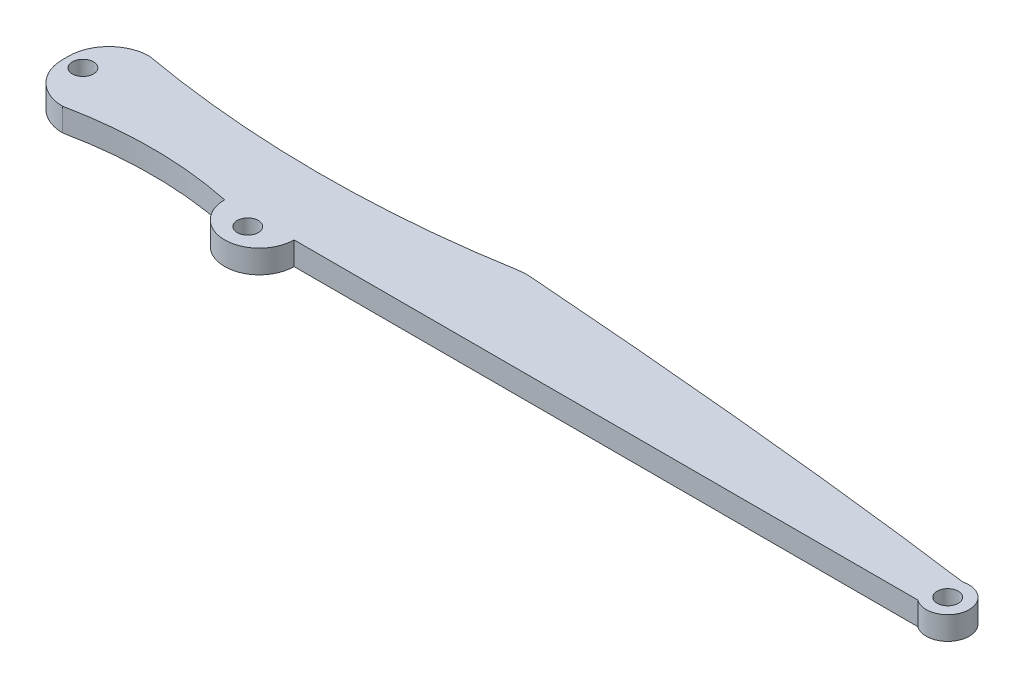
ISO-10303-21;
HEADER;
FILE_DESCRIPTION(('STEP AP214'),'2;1');
FILE_NAME('part.step','',(''),(''),'','','');
FILE_SCHEMA(('AUTOMOTIVE_DESIGN { 1 0 10303 214 1 1 1 1 }'));
ENDSEC;
DATA;
#1=APPLICATION_CONTEXT('core data for automotive mechanical design processes');
#2=APPLICATION_PROTOCOL_DEFINITION('international standard','automotive_design',2000,#1);
#3=PRODUCT_CONTEXT('',#1,'mechanical');
#4=PRODUCT('Part','Part','',(#3));
#5=PRODUCT_RELATED_PRODUCT_CATEGORY('part','',(#4));
#6=PRODUCT_DEFINITION_FORMATION('','',#4);
#7=PRODUCT_DEFINITION_CONTEXT('part definition',#1,'design');
#8=PRODUCT_DEFINITION('design','',#6,#7);
#9=PRODUCT_DEFINITION_SHAPE('','',#8);
#10=(LENGTH_UNIT() NAMED_UNIT(*) SI_UNIT(.MILLI.,.METRE.));
#11=(NAMED_UNIT(*) PLANE_ANGLE_UNIT() SI_UNIT($,.RADIAN.));
#12=(NAMED_UNIT(*) SI_UNIT($,.STERADIAN.) SOLID_ANGLE_UNIT());
#13=UNCERTAINTY_MEASURE_WITH_UNIT(LENGTH_MEASURE(1.E-05),#10,'distance_accuracy_value','');
#14=(GEOMETRIC_REPRESENTATION_CONTEXT(3) GLOBAL_UNCERTAINTY_ASSIGNED_CONTEXT((#13)) GLOBAL_UNIT_ASSIGNED_CONTEXT((#10,
#11,#12)) REPRESENTATION_CONTEXT('',''));
#15=CARTESIAN_POINT('',(0.,0.,0.));
#16=DIRECTION('',(0.,0.,1.));
#17=DIRECTION('',(1.,0.,0.));
#18=AXIS2_PLACEMENT_3D('',#15,#16,#17);
#19=CARTESIAN_POINT('',(-80.,4.,7.5));
#20=DIRECTION('',(0.,0.,-1.));
#21=DIRECTION('',(-1.,0.,0.));
#22=AXIS2_PLACEMENT_3D('',#19,#20,#21);
#23=PLANE('',#22);
#24=DIRECTION('',(1.,0.,0.));
#25=VECTOR('',#24,1.);
#26=CARTESIAN_POINT('',(-80.,0.,7.5));
#27=LINE('',#26,#25);
#28=CARTESIAN_POINT('',(-33.,0.,7.5));
#29=VERTEX_POINT('',#28);
#30=CARTESIAN_POINT('',(74.8247790125888,0.,7.5));
#31=VERTEX_POINT('',#30);
#32=EDGE_CURVE('E125',#29,#31,#27,.T.);
#33=ORIENTED_EDGE('',*,*,#32,.T.);
#34=DIRECTION('',(0.,1.,0.));
#35=VECTOR('',#34,1.);
#36=CARTESIAN_POINT('',(74.8247790125888,-10.4810634361497,7.5));
#37=LINE('',#36,#35);
#38=CARTESIAN_POINT('',(74.8247790125888,4.,7.5));
#39=VERTEX_POINT('',#38);
#40=EDGE_CURVE('E109',#31,#39,#37,.T.);
#41=ORIENTED_EDGE('',*,*,#40,.T.);
#42=DIRECTION('',(1.,0.,0.));
#43=VECTOR('',#42,1.);
#44=CARTESIAN_POINT('',(-80.,4.,7.5));
#45=LINE('',#44,#43);
#46=CARTESIAN_POINT('',(-33.,4.,7.5));
#47=VERTEX_POINT('',#46);
#48=EDGE_CURVE('E137',#47,#39,#45,.T.);
#49=ORIENTED_EDGE('',*,*,#48,.F.);
#50=DIRECTION('',(0.,-1.,0.));
#51=VECTOR('',#50,1.);
#52=CARTESIAN_POINT('',(-33.,17.4164078649987,7.5));
#53=LINE('',#52,#51);
#54=EDGE_CURVE('E131',#47,#29,#53,.T.);
#55=ORIENTED_EDGE('',*,*,#54,.T.);
#56=EDGE_LOOP('',(#33,#41,#49,#55));
#57=FACE_BOUND('',#56,.T.);
#58=ADVANCED_FACE('F33',(#57),#23,.F.);
#59=CARTESIAN_POINT('',(-80.,4.,-7.5));
#60=DIRECTION('',(1.,0.,0.));
#61=DIRECTION('',(0.,0.,-1.));
#62=AXIS2_PLACEMENT_3D('',#59,#60,#61);
#63=PLANE('',#62);
#64=DIRECTION('',(0.,0.,1.));
#65=VECTOR('',#64,1.);
#66=CARTESIAN_POINT('',(-80.,4.,-7.5));
#67=LINE('',#66,#65);
#68=CARTESIAN_POINT('',(-80.,4.,-0.5));
#69=VERTEX_POINT('',#68);
#70=CARTESIAN_POINT('',(-80.,4.,0.5));
#71=VERTEX_POINT('',#70);
#72=EDGE_CURVE('E133',#69,#71,#67,.T.);
#73=ORIENTED_EDGE('',*,*,#72,.F.);
#74=DIRECTION('',(0.,-1.,0.));
#75=VECTOR('',#74,1.);
#76=CARTESIAN_POINT('',(-80.,4.,-0.5));
#77=LINE('',#76,#75);
#78=CARTESIAN_POINT('',(-80.,0.,-0.5));
#79=VERTEX_POINT('',#78);
#80=EDGE_CURVE('E146',#69,#79,#77,.T.);
#81=ORIENTED_EDGE('',*,*,#80,.T.);
#82=DIRECTION('',(0.,0.,1.));
#83=VECTOR('',#82,1.);
#84=CARTESIAN_POINT('',(-80.,0.,-7.5));
#85=LINE('',#84,#83);
#86=CARTESIAN_POINT('',(-80.,0.,0.5));
#87=VERTEX_POINT('',#86);
#88=EDGE_CURVE('E134',#79,#87,#85,.T.);
#89=ORIENTED_EDGE('',*,*,#88,.T.);
#90=DIRECTION('',(0.,-1.,0.));
#91=VECTOR('',#90,1.);
#92=CARTESIAN_POINT('',(-80.,4.,0.5));
#93=LINE('',#92,#91);
#94=EDGE_CURVE('E144',#87,#71,#93,.F.);
#95=ORIENTED_EDGE('',*,*,#94,.T.);
#96=EDGE_LOOP('',(#73,#81,#89,#95));
#97=FACE_BOUND('',#96,.T.);
#98=ADVANCED_FACE('F225',(#97),#63,.F.);
#99=CARTESIAN_POINT('',(0.,4.,0.));
#100=DIRECTION('',(0.,1.,0.));
#101=DIRECTION('',(0.,0.,1.));
#102=AXIS2_PLACEMENT_3D('',#99,#100,#101);
#103=PLANE('',#102);
#104=CARTESIAN_POINT('',(77.,4.,4.5));
#105=DIRECTION('',(0.,1.,0.));
#106=DIRECTION('',(0.,0.,1.));
#107=AXIS2_PLACEMENT_3D('',#104,#105,#106);
#108=CIRCLE('',#107,1.82499999999999);
#109=CARTESIAN_POINT('',(77.,4.,6.32499999999999));
#110=VERTEX_POINT('',#109);
#111=EDGE_CURVE('E282',#110,#110,#108,.T.);
#112=ORIENTED_EDGE('',*,*,#111,.F.);
#113=EDGE_LOOP('',(#112));
#114=FACE_BOUND('',#113,.T.);
#115=CARTESIAN_POINT('',(-8.23154683285153,4.,-7.5));
#116=CARTESIAN_POINT('',(14.2900819028801,4.,-5.87033542457917));
#117=CARTESIAN_POINT('',(49.538058277819,4.,-2.84864090917084));
#118=CARTESIAN_POINT('',(69.5080011227634,4.,0.0694157231703041));
#119=CARTESIAN_POINT('',(80.,4.,1.44942523242543));
#120=B_SPLINE_CURVE_WITH_KNOTS('',4,(#115,#116,#117,#118,#119),.UNSPECIFIED.,.F.,.F.,(5,5),(0.,
1.),.UNSPECIFIED.);
#121=CARTESIAN_POINT('',(-6.91713882315305,4.,-7.40429554869277));
#122=VERTEX_POINT('',#121);
#123=CARTESIAN_POINT('',(76.0393114114951,4.,0.921080640753333));
#124=VERTEX_POINT('',#123);
#125=EDGE_CURVE('E171',#122,#124,#120,.T.);
#126=ORIENTED_EDGE('',*,*,#125,.F.);
#127=CARTESIAN_POINT('',(-7.64776066769948,4.,2.56897832302416));
#128=DIRECTION('',(0.,1.,0.));
#129=DIRECTION('',(0.,0.,1.));
#130=AXIS2_PLACEMENT_3D('',#127,#128,#129);
#131=CIRCLE('',#130,10.);
#132=CARTESIAN_POINT('',(-9.33922759363612,4.,-7.28693054620055));
#133=VERTEX_POINT('',#132);
#134=EDGE_CURVE('E55',#122,#133,#131,.T.);
#135=ORIENTED_EDGE('',*,*,#134,.T.);
#136=CARTESIAN_POINT('',(-40.5610772171569,4.,-189.211684675024));
#137=DIRECTION('',(0.,1.,0.));
#138=DIRECTION('',(0.,0.,1.));
#139=AXIS2_PLACEMENT_3D('',#136,#137,#138);
#140=CIRCLE('',#139,184.584452375455);
#141=CARTESIAN_POINT('',(-73.,4.,-7.5));
#142=VERTEX_POINT('',#141);
#143=EDGE_CURVE('E120',#142,#133,#140,.T.);
#144=ORIENTED_EDGE('',*,*,#143,.F.);
#145=CARTESIAN_POINT('',(-73.,4.,-0.5));
#146=DIRECTION('',(0.,1.,0.));
#147=DIRECTION('',(0.,0.,1.));
#148=AXIS2_PLACEMENT_3D('',#145,#146,#147);
#149=CIRCLE('',#148,7.);
#150=EDGE_CURVE('E159',#142,#69,#149,.T.);
#151=ORIENTED_EDGE('',*,*,#150,.T.);
#152=ORIENTED_EDGE('',*,*,#72,.T.);
#153=CARTESIAN_POINT('',(-73.,4.,0.5));
#154=DIRECTION('',(0.,1.,0.));
#155=DIRECTION('',(0.,0.,1.));
#156=AXIS2_PLACEMENT_3D('',#153,#154,#155);
#157=CIRCLE('',#156,7.);
#158=CARTESIAN_POINT('',(-73.,4.,7.5));
#159=VERTEX_POINT('',#158);
#160=EDGE_CURVE('E156',#71,#159,#157,.T.);
#161=ORIENTED_EDGE('',*,*,#160,.T.);
#162=CARTESIAN_POINT('',(-59.,4.,74.1454049428766));
#163=DIRECTION('',(0.,1.,0.));
#164=DIRECTION('',(0.,0.,1.));
#165=AXIS2_PLACEMENT_3D('',#162,#163,#164);
#166=CIRCLE('',#165,68.1);
#167=CARTESIAN_POINT('',(-45.,4.,7.5));
#168=VERTEX_POINT('',#167);
#169=EDGE_CURVE('E181',#168,#159,#166,.T.);
#170=ORIENTED_EDGE('',*,*,#169,.F.);
#171=CARTESIAN_POINT('',(-39.,4.,7.5));
#172=DIRECTION('',(0.,1.,0.));
#173=DIRECTION('',(0.,0.,1.));
#174=AXIS2_PLACEMENT_3D('',#171,#172,#173);
#175=CIRCLE('',#174,6.);
#176=EDGE_CURVE('E140',#168,#47,#175,.T.);
#177=ORIENTED_EDGE('',*,*,#176,.T.);
#178=ORIENTED_EDGE('',*,*,#48,.T.);
#179=CARTESIAN_POINT('',(77.,4.,4.5));
#180=DIRECTION('',(0.,1.,0.));
#181=DIRECTION('',(0.,0.,1.));
#182=AXIS2_PLACEMENT_3D('',#179,#180,#181);
#183=CIRCLE('',#182,3.7056155148739);
#184=EDGE_CURVE('E116',#39,#124,#183,.T.);
#185=ORIENTED_EDGE('',*,*,#184,.T.);
#186=EDGE_LOOP('',(#126,#135,#144,#151,#152,#161,#170,#177,#178,#185));
#187=FACE_BOUND('',#186,.T.);
#188=CARTESIAN_POINT('',(-77.,4.,0.));
#189=DIRECTION('',(0.,1.,0.));
#190=DIRECTION('',(0.,0.,1.));
#191=AXIS2_PLACEMENT_3D('',#188,#189,#190);
#192=CIRCLE('',#191,1.82499999999999);
#193=CARTESIAN_POINT('',(-77.,4.,1.82499999999999));
#194=VERTEX_POINT('',#193);
#195=EDGE_CURVE('E197',#194,#194,#192,.T.);
#196=ORIENTED_EDGE('',*,*,#195,.F.);
#197=EDGE_LOOP('',(#196));
#198=FACE_BOUND('',#197,.T.);
#199=CARTESIAN_POINT('',(-39.,4.,9.5));
#200=DIRECTION('',(0.,1.,0.));
#201=DIRECTION('',(0.,0.,1.));
#202=AXIS2_PLACEMENT_3D('',#199,#200,#201);
#203=CIRCLE('',#202,1.825);
#204=CARTESIAN_POINT('',(-39.,4.,11.325));
#205=VERTEX_POINT('',#204);
#206=EDGE_CURVE('E178',#205,#205,#203,.T.);
#207=ORIENTED_EDGE('',*,*,#206,.F.);
#208=EDGE_LOOP('',(#207));
#209=FACE_BOUND('',#208,.T.);
#210=ADVANCED_FACE('F174',(#114,#187,#198,#209),#103,.T.);
#211=CARTESIAN_POINT('',(0.,0.,0.));
#212=DIRECTION('',(0.,1.,0.));
#213=DIRECTION('',(0.,0.,1.));
#214=AXIS2_PLACEMENT_3D('',#211,#212,#213);
#215=PLANE('',#214);
#216=CARTESIAN_POINT('',(77.,0.,4.5));
#217=DIRECTION('',(0.,1.,0.));
#218=DIRECTION('',(0.,0.,1.));
#219=AXIS2_PLACEMENT_3D('',#216,#217,#218);
#220=CIRCLE('',#219,1.82499999999999);
#221=CARTESIAN_POINT('',(77.,0.,6.32499999999999));
#222=VERTEX_POINT('',#221);
#223=EDGE_CURVE('E284',#222,#222,#220,.T.);
#224=ORIENTED_EDGE('',*,*,#223,.T.);
#225=EDGE_LOOP('',(#224));
#226=FACE_BOUND('',#225,.T.);
#227=CARTESIAN_POINT('',(-77.,0.,0.));
#228=DIRECTION('',(0.,1.,0.));
#229=DIRECTION('',(0.,0.,1.));
#230=AXIS2_PLACEMENT_3D('',#227,#228,#229);
#231=CIRCLE('',#230,1.82499999999999);
#232=CARTESIAN_POINT('',(-77.,0.,1.82499999999999));
#233=VERTEX_POINT('',#232);
#234=EDGE_CURVE('E190',#233,#233,#231,.T.);
#235=ORIENTED_EDGE('',*,*,#234,.T.);
#236=EDGE_LOOP('',(#235));
#237=FACE_BOUND('',#236,.T.);
#238=CARTESIAN_POINT('',(-39.,0.,9.5));
#239=DIRECTION('',(0.,1.,0.));
#240=DIRECTION('',(0.,0.,1.));
#241=AXIS2_PLACEMENT_3D('',#238,#239,#240);
#242=CIRCLE('',#241,1.825);
#243=CARTESIAN_POINT('',(-39.,0.,11.325));
#244=VERTEX_POINT('',#243);
#245=EDGE_CURVE('E200',#244,#244,#242,.T.);
#246=ORIENTED_EDGE('',*,*,#245,.T.);
#247=EDGE_LOOP('',(#246));
#248=FACE_BOUND('',#247,.T.);
#249=CARTESIAN_POINT('',(-40.5610772171569,0.,-189.211684675024));
#250=DIRECTION('',(0.,1.,0.));
#251=DIRECTION('',(0.,0.,1.));
#252=AXIS2_PLACEMENT_3D('',#249,#250,#251);
#253=CIRCLE('',#252,184.584452375455);
#254=CARTESIAN_POINT('',(-73.,0.,-7.5));
#255=VERTEX_POINT('',#254);
#256=CARTESIAN_POINT('',(-9.33922759363612,0.,-7.28693054620055));
#257=VERTEX_POINT('',#256);
#258=EDGE_CURVE('E231',#255,#257,#253,.T.);
#259=ORIENTED_EDGE('',*,*,#258,.T.);
#260=CARTESIAN_POINT('',(-7.64776066769948,0.,2.56897832302416));
#261=DIRECTION('',(0.,1.,0.));
#262=DIRECTION('',(0.,0.,1.));
#263=AXIS2_PLACEMENT_3D('',#260,#261,#262);
#264=CIRCLE('',#263,10.);
#265=CARTESIAN_POINT('',(-6.91713882315305,0.,-7.40429554869277));
#266=VERTEX_POINT('',#265);
#267=EDGE_CURVE('E11',#257,#266,#264,.F.);
#268=ORIENTED_EDGE('',*,*,#267,.T.);
#269=CARTESIAN_POINT('',(-8.23154683285153,0.,-7.5));
#270=CARTESIAN_POINT('',(14.2900819028801,0.,-5.87033542457917));
#271=CARTESIAN_POINT('',(49.538058277819,0.,-2.84864090917084));
#272=CARTESIAN_POINT('',(69.5080011227634,0.,0.0694157231703041));
#273=CARTESIAN_POINT('',(80.,0.,1.44942523242543));
#274=B_SPLINE_CURVE_WITH_KNOTS('',4,(#269,#270,#271,#272,#273),.UNSPECIFIED.,.F.,.F.,(5,5),(0.,
1.),.UNSPECIFIED.);
#275=CARTESIAN_POINT('',(76.0393114114951,0.,0.921080640753333));
#276=VERTEX_POINT('',#275);
#277=EDGE_CURVE('E128',#266,#276,#274,.T.);
#278=ORIENTED_EDGE('',*,*,#277,.T.);
#279=CARTESIAN_POINT('',(77.,0.,4.5));
#280=DIRECTION('',(0.,1.,0.));
#281=DIRECTION('',(0.,0.,1.));
#282=AXIS2_PLACEMENT_3D('',#279,#280,#281);
#283=CIRCLE('',#282,3.7056155148739);
#284=EDGE_CURVE('E113',#276,#31,#283,.F.);
#285=ORIENTED_EDGE('',*,*,#284,.T.);
#286=ORIENTED_EDGE('',*,*,#32,.F.);
#287=CARTESIAN_POINT('',(-39.,0.,7.5));
#288=DIRECTION('',(0.,1.,0.));
#289=DIRECTION('',(0.,0.,1.));
#290=AXIS2_PLACEMENT_3D('',#287,#288,#289);
#291=CIRCLE('',#290,6.);
#292=CARTESIAN_POINT('',(-45.,0.,7.5));
#293=VERTEX_POINT('',#292);
#294=EDGE_CURVE('E205',#293,#29,#291,.T.);
#295=ORIENTED_EDGE('',*,*,#294,.F.);
#296=CARTESIAN_POINT('',(-59.,0.,74.1454049428766));
#297=DIRECTION('',(0.,1.,0.));
#298=DIRECTION('',(0.,0.,1.));
#299=AXIS2_PLACEMENT_3D('',#296,#297,#298);
#300=CIRCLE('',#299,68.1);
#301=CARTESIAN_POINT('',(-73.,0.,7.5));
#302=VERTEX_POINT('',#301);
#303=EDGE_CURVE('E176',#293,#302,#300,.T.);
#304=ORIENTED_EDGE('',*,*,#303,.T.);
#305=CARTESIAN_POINT('',(-73.,0.,0.5));
#306=DIRECTION('',(0.,1.,0.));
#307=DIRECTION('',(0.,0.,1.));
#308=AXIS2_PLACEMENT_3D('',#305,#306,#307);
#309=CIRCLE('',#308,7.);
#310=EDGE_CURVE('E149',#302,#87,#309,.F.);
#311=ORIENTED_EDGE('',*,*,#310,.T.);
#312=ORIENTED_EDGE('',*,*,#88,.F.);
#313=CARTESIAN_POINT('',(-73.,0.,-0.5));
#314=DIRECTION('',(0.,1.,0.));
#315=DIRECTION('',(0.,0.,1.));
#316=AXIS2_PLACEMENT_3D('',#313,#314,#315);
#317=CIRCLE('',#316,7.);
#318=EDGE_CURVE('E151',#79,#255,#317,.F.);
#319=ORIENTED_EDGE('',*,*,#318,.T.);
#320=EDGE_LOOP('',(#259,#268,#278,#285,#286,#295,#304,#311,#312,#319));
#321=FACE_BOUND('',#320,.T.);
#322=ADVANCED_FACE('F123',(#226,#237,#248,#321),#215,.F.);
#323=CARTESIAN_POINT('',(-39.,17.4164078649987,7.5));
#324=DIRECTION('',(0.,-1.,0.));
#325=DIRECTION('',(0.,0.,-1.));
#326=AXIS2_PLACEMENT_3D('',#323,#324,#325);
#327=CYLINDRICAL_SURFACE('',#326,6.);
#328=ORIENTED_EDGE('',*,*,#176,.F.);
#329=DIRECTION('',(0.,-1.,0.));
#330=VECTOR('',#329,1.);
#331=CARTESIAN_POINT('',(-45.,17.4164078649987,7.5));
#332=LINE('',#331,#330);
#333=EDGE_CURVE('E196',#168,#293,#332,.T.);
#334=ORIENTED_EDGE('',*,*,#333,.T.);
#335=ORIENTED_EDGE('',*,*,#294,.T.);
#336=ORIENTED_EDGE('',*,*,#54,.F.);
#337=EDGE_LOOP('',(#328,#334,#335,#336));
#338=FACE_BOUND('',#337,.T.);
#339=ADVANCED_FACE('F214',(#338),#327,.T.);
#340=CARTESIAN_POINT('',(-39.,0.,9.5));
#341=DIRECTION('',(0.,1.,0.));
#342=DIRECTION('',(0.,0.,1.));
#343=AXIS2_PLACEMENT_3D('',#340,#341,#342);
#344=CYLINDRICAL_SURFACE('',#343,1.825);
#345=ORIENTED_EDGE('',*,*,#245,.F.);
#346=EDGE_LOOP('',(#345));
#347=FACE_BOUND('',#346,.T.);
#348=ORIENTED_EDGE('',*,*,#206,.T.);
#349=EDGE_LOOP('',(#348));
#350=FACE_BOUND('',#349,.T.);
#351=ADVANCED_FACE('F268',(#347,#350),#344,.F.);
#352=CARTESIAN_POINT('',(-77.,0.,0.));
#353=DIRECTION('',(0.,1.,0.));
#354=DIRECTION('',(0.,0.,1.));
#355=AXIS2_PLACEMENT_3D('',#352,#353,#354);
#356=CYLINDRICAL_SURFACE('',#355,1.82499999999999);
#357=ORIENTED_EDGE('',*,*,#234,.F.);
#358=EDGE_LOOP('',(#357));
#359=FACE_BOUND('',#358,.T.);
#360=ORIENTED_EDGE('',*,*,#195,.T.);
#361=EDGE_LOOP('',(#360));
#362=FACE_BOUND('',#361,.T.);
#363=ADVANCED_FACE('F265',(#359,#362),#356,.F.);
#364=DIRECTION('',(0.,1.,0.));
#365=VECTOR('',#364,1.);
#366=SURFACE_OF_LINEAR_EXTRUSION('',#274,#365);
#367=ORIENTED_EDGE('',*,*,#277,.F.);
#368=DIRECTION('',(0.,1.,0.));
#369=VECTOR('',#368,1.);
#370=CARTESIAN_POINT('',(-6.91713882315305,0.,-7.40429554869277));
#371=LINE('',#370,#369);
#372=EDGE_CURVE('E165',#266,#122,#371,.T.);
#373=ORIENTED_EDGE('',*,*,#372,.T.);
#374=ORIENTED_EDGE('',*,*,#125,.T.);
#375=DIRECTION('',(0.,1.,0.));
#376=VECTOR('',#375,1.);
#377=CARTESIAN_POINT('',(76.0393114114951,0.,0.921080640753335));
#378=LINE('',#377,#376);
#379=EDGE_CURVE('E163',#124,#276,#378,.F.);
#380=ORIENTED_EDGE('',*,*,#379,.T.);
#381=EDGE_LOOP('',(#367,#373,#374,#380));
#382=FACE_BOUND('',#381,.T.);
#383=ADVANCED_FACE('F170',(#382),#366,.F.);
#384=CARTESIAN_POINT('',(-73.,4.,-0.5));
#385=DIRECTION('',(0.,-1.,0.));
#386=DIRECTION('',(0.,0.,-1.));
#387=AXIS2_PLACEMENT_3D('',#384,#385,#386);
#388=CYLINDRICAL_SURFACE('',#387,7.);
#389=ORIENTED_EDGE('',*,*,#150,.F.);
#390=DIRECTION('',(0.,-1.,0.));
#391=VECTOR('',#390,1.);
#392=CARTESIAN_POINT('',(-73.,4.,-7.5));
#393=LINE('',#392,#391);
#394=EDGE_CURVE('E154',#255,#142,#393,.F.);
#395=ORIENTED_EDGE('',*,*,#394,.F.);
#396=ORIENTED_EDGE('',*,*,#318,.F.);
#397=ORIENTED_EDGE('',*,*,#80,.F.);
#398=EDGE_LOOP('',(#389,#395,#396,#397));
#399=FACE_BOUND('',#398,.T.);
#400=ADVANCED_FACE('F230',(#399),#388,.T.);
#401=CARTESIAN_POINT('',(-73.,4.,0.5));
#402=DIRECTION('',(0.,-1.,0.));
#403=DIRECTION('',(0.,0.,-1.));
#404=AXIS2_PLACEMENT_3D('',#401,#402,#403);
#405=CYLINDRICAL_SURFACE('',#404,7.);
#406=ORIENTED_EDGE('',*,*,#160,.F.);
#407=ORIENTED_EDGE('',*,*,#94,.F.);
#408=ORIENTED_EDGE('',*,*,#310,.F.);
#409=DIRECTION('',(0.,-1.,0.));
#410=VECTOR('',#409,1.);
#411=CARTESIAN_POINT('',(-73.,4.,7.5));
#412=LINE('',#411,#410);
#413=EDGE_CURVE('E161',#159,#302,#412,.T.);
#414=ORIENTED_EDGE('',*,*,#413,.F.);
#415=EDGE_LOOP('',(#406,#407,#408,#414));
#416=FACE_BOUND('',#415,.T.);
#417=ADVANCED_FACE('F222',(#416),#405,.T.);
#418=CARTESIAN_POINT('',(-59.,0.,74.1454049428766));
#419=DIRECTION('',(0.,1.,0.));
#420=DIRECTION('',(0.,0.,1.));
#421=AXIS2_PLACEMENT_3D('',#418,#419,#420);
#422=CYLINDRICAL_SURFACE('',#421,68.1);
#423=ORIENTED_EDGE('',*,*,#169,.T.);
#424=ORIENTED_EDGE('',*,*,#413,.T.);
#425=ORIENTED_EDGE('',*,*,#303,.F.);
#426=ORIENTED_EDGE('',*,*,#333,.F.);
#427=EDGE_LOOP('',(#423,#424,#425,#426));
#428=FACE_BOUND('',#427,.T.);
#429=ADVANCED_FACE('F251',(#428),#422,.F.);
#430=CARTESIAN_POINT('',(-40.5610772171569,0.,-189.211684675024));
#431=DIRECTION('',(0.,1.,0.));
#432=DIRECTION('',(0.,0.,1.));
#433=AXIS2_PLACEMENT_3D('',#430,#431,#432);
#434=CYLINDRICAL_SURFACE('',#433,184.584452375455);
#435=ORIENTED_EDGE('',*,*,#143,.T.);
#436=DIRECTION('',(0.,1.,0.));
#437=VECTOR('',#436,1.);
#438=CARTESIAN_POINT('',(-9.33922759363611,0.,-7.28693054620055));
#439=LINE('',#438,#437);
#440=EDGE_CURVE('E41',#133,#257,#439,.F.);
#441=ORIENTED_EDGE('',*,*,#440,.T.);
#442=ORIENTED_EDGE('',*,*,#258,.F.);
#443=ORIENTED_EDGE('',*,*,#394,.T.);
#444=EDGE_LOOP('',(#435,#441,#442,#443));
#445=FACE_BOUND('',#444,.T.);
#446=ADVANCED_FACE('F255',(#445),#434,.F.);
#447=CARTESIAN_POINT('',(77.,-10.4810634361497,4.5));
#448=DIRECTION('',(0.,1.,0.));
#449=DIRECTION('',(0.,0.,1.));
#450=AXIS2_PLACEMENT_3D('',#447,#448,#449);
#451=CYLINDRICAL_SURFACE('',#450,3.7056155148739);
#452=ORIENTED_EDGE('',*,*,#40,.F.);
#453=ORIENTED_EDGE('',*,*,#284,.F.);
#454=ORIENTED_EDGE('',*,*,#379,.F.);
#455=ORIENTED_EDGE('',*,*,#184,.F.);
#456=EDGE_LOOP('',(#452,#453,#454,#455));
#457=FACE_BOUND('',#456,.T.);
#458=ADVANCED_FACE('F111',(#457),#451,.T.);
#459=CARTESIAN_POINT('',(77.,0.,4.5));
#460=DIRECTION('',(0.,1.,0.));
#461=DIRECTION('',(0.,0.,1.));
#462=AXIS2_PLACEMENT_3D('',#459,#460,#461);
#463=CYLINDRICAL_SURFACE('',#462,1.82499999999999);
#464=ORIENTED_EDGE('',*,*,#223,.F.);
#465=EDGE_LOOP('',(#464));
#466=FACE_BOUND('',#465,.T.);
#467=ORIENTED_EDGE('',*,*,#111,.T.);
#468=EDGE_LOOP('',(#467));
#469=FACE_BOUND('',#468,.T.);
#470=ADVANCED_FACE('F234',(#466,#469),#463,.F.);
#471=CARTESIAN_POINT('',(-7.64776066769948,2.,2.56897832302416));
#472=DIRECTION('',(0.,1.,0.));
#473=DIRECTION('',(0.,0.,1.));
#474=AXIS2_PLACEMENT_3D('',#471,#472,#473);
#475=CYLINDRICAL_SURFACE('',#474,10.);
#476=ORIENTED_EDGE('',*,*,#267,.F.);
#477=ORIENTED_EDGE('',*,*,#440,.F.);
#478=ORIENTED_EDGE('',*,*,#134,.F.);
#479=ORIENTED_EDGE('',*,*,#372,.F.);
#480=EDGE_LOOP('',(#476,#477,#478,#479));
#481=FACE_BOUND('',#480,.T.);
#482=ADVANCED_FACE('F35',(#481),#475,.T.);
#483=CLOSED_SHELL('',(#58,#98,#210,#322,#339,#351,#363,#383,#400,#417,#429,#446,#458,#470,#482));
#484=MANIFOLD_SOLID_BREP('B2',#483);
#485=ADVANCED_BREP_SHAPE_REPRESENTATION('',(#18,#484),#14);
#486=SHAPE_DEFINITION_REPRESENTATION(#9,#485);
ENDSEC;
END-ISO-10303-21;
